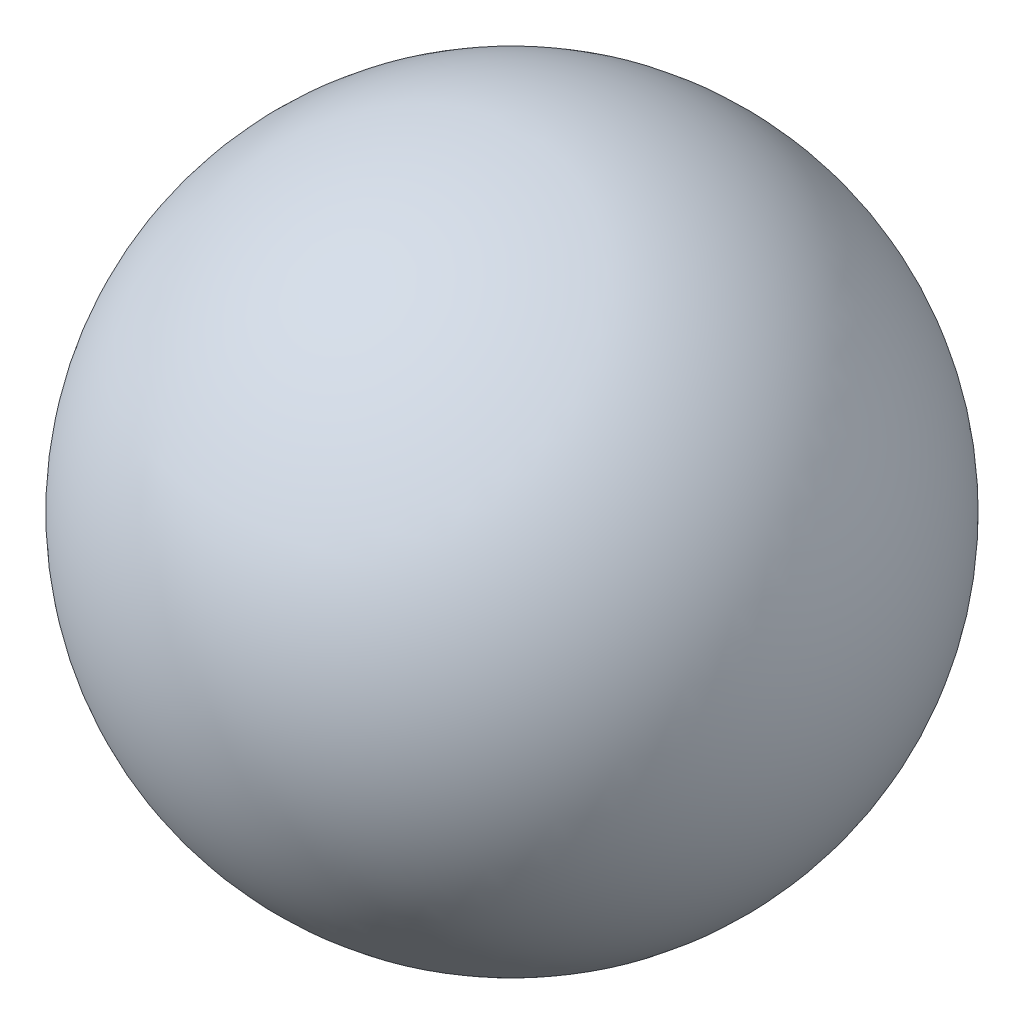
ISO-10303-21;
HEADER;
FILE_DESCRIPTION(('STEP AP214'),'2;1');
FILE_NAME('part.step','',(''),(''),'','','');
FILE_SCHEMA(('AUTOMOTIVE_DESIGN { 1 0 10303 214 1 1 1 1 }'));
ENDSEC;
DATA;
#1=APPLICATION_CONTEXT('core data for automotive mechanical design processes');
#2=APPLICATION_PROTOCOL_DEFINITION('international standard','automotive_design',2000,#1);
#3=PRODUCT_CONTEXT('',#1,'mechanical');
#4=PRODUCT('Part','Part','',(#3));
#5=PRODUCT_RELATED_PRODUCT_CATEGORY('part','',(#4));
#6=PRODUCT_DEFINITION_FORMATION('','',#4);
#7=PRODUCT_DEFINITION_CONTEXT('part definition',#1,'design');
#8=PRODUCT_DEFINITION('design','',#6,#7);
#9=PRODUCT_DEFINITION_SHAPE('','',#8);
#10=(LENGTH_UNIT() NAMED_UNIT(*) SI_UNIT(.MILLI.,.METRE.));
#11=(NAMED_UNIT(*) PLANE_ANGLE_UNIT() SI_UNIT($,.RADIAN.));
#12=(NAMED_UNIT(*) SI_UNIT($,.STERADIAN.) SOLID_ANGLE_UNIT());
#13=UNCERTAINTY_MEASURE_WITH_UNIT(LENGTH_MEASURE(1.E-05),#10,'distance_accuracy_value','');
#14=(GEOMETRIC_REPRESENTATION_CONTEXT(3) GLOBAL_UNCERTAINTY_ASSIGNED_CONTEXT((#13)) GLOBAL_UNIT_ASSIGNED_CONTEXT((#10,
#11,#12)) REPRESENTATION_CONTEXT('',''));
#15=CARTESIAN_POINT('',(0.,0.,0.));
#16=DIRECTION('',(0.,0.,1.));
#17=DIRECTION('',(1.,0.,0.));
#18=AXIS2_PLACEMENT_3D('',#15,#16,#17);
#19=CARTESIAN_POINT('',(0.,120.,0.));
#20=DIRECTION('',(0.,-1.,0.));
#21=DIRECTION('',(-1.,0.,0.));
#22=AXIS2_PLACEMENT_3D('',#19,#20,#21);
#23=SPHERICAL_SURFACE('',#22,120.);
#24=CARTESIAN_POINT('',(0.,0.,0.));
#25=VERTEX_POINT('',#24);
#26=VERTEX_LOOP('',#25);
#27=FACE_BOUND('',#26,.T.);
#28=ADVANCED_FACE('F36',(#27),#23,.T.);
#29=CLOSED_SHELL('',(#28));
#30=MANIFOLD_SOLID_BREP('B2',#29);
#31=ADVANCED_BREP_SHAPE_REPRESENTATION('',(#18,#30),#14);
#32=SHAPE_DEFINITION_REPRESENTATION(#9,#31);
ENDSEC;
END-ISO-10303-21;
